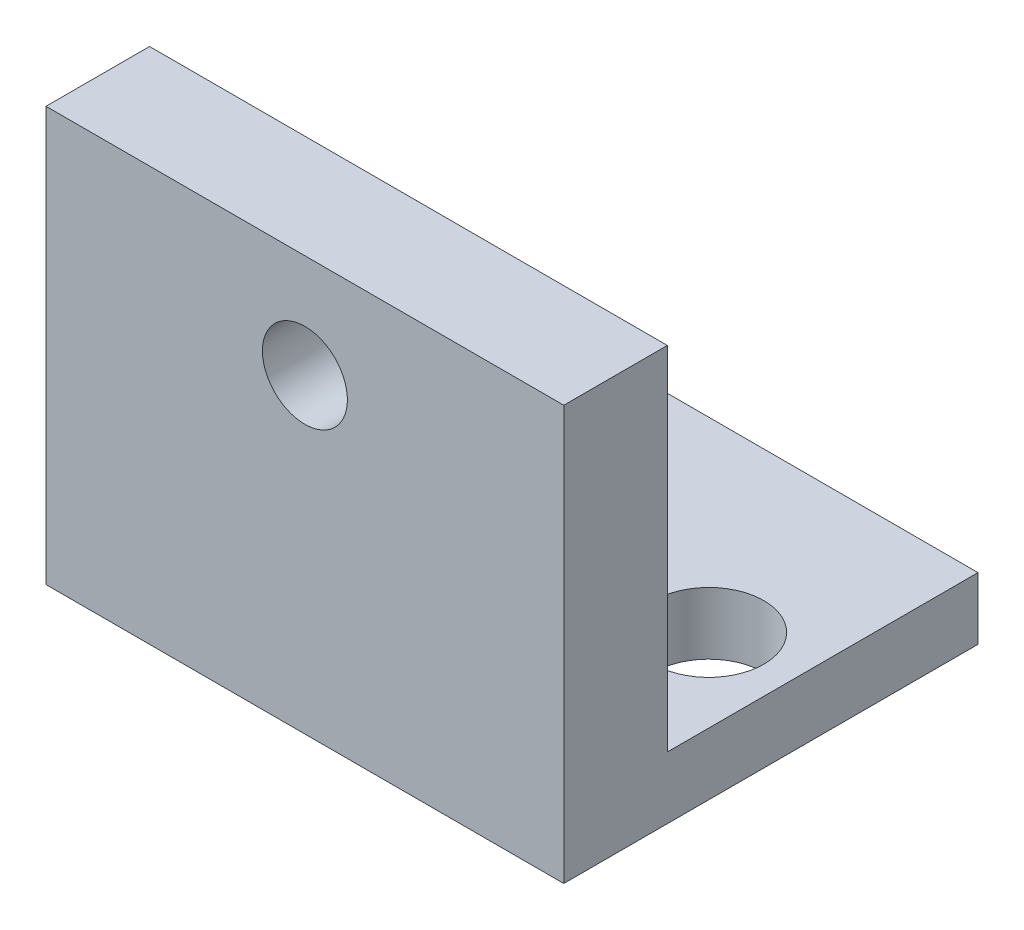
ISO-10303-21;
HEADER;
FILE_DESCRIPTION(('STEP AP214'),'2;1');
FILE_NAME('part.step','',(''),(''),'','','');
FILE_SCHEMA(('AUTOMOTIVE_DESIGN { 1 0 10303 214 1 1 1 1 }'));
ENDSEC;
DATA;
#1=APPLICATION_CONTEXT('core data for automotive mechanical design processes');
#2=APPLICATION_PROTOCOL_DEFINITION('international standard','automotive_design',2000,#1);
#3=PRODUCT_CONTEXT('',#1,'mechanical');
#4=PRODUCT('Part','Part','',(#3));
#5=PRODUCT_RELATED_PRODUCT_CATEGORY('part','',(#4));
#6=PRODUCT_DEFINITION_FORMATION('','',#4);
#7=PRODUCT_DEFINITION_CONTEXT('part definition',#1,'design');
#8=PRODUCT_DEFINITION('design','',#6,#7);
#9=PRODUCT_DEFINITION_SHAPE('','',#8);
#10=(LENGTH_UNIT() NAMED_UNIT(*) SI_UNIT(.MILLI.,.METRE.));
#11=(NAMED_UNIT(*) PLANE_ANGLE_UNIT() SI_UNIT($,.RADIAN.));
#12=(NAMED_UNIT(*) SI_UNIT($,.STERADIAN.) SOLID_ANGLE_UNIT());
#13=UNCERTAINTY_MEASURE_WITH_UNIT(LENGTH_MEASURE(1.E-05),#10,'distance_accuracy_value','');
#14=(GEOMETRIC_REPRESENTATION_CONTEXT(3) GLOBAL_UNCERTAINTY_ASSIGNED_CONTEXT((#13)) GLOBAL_UNIT_ASSIGNED_CONTEXT((#10,
#11,#12)) REPRESENTATION_CONTEXT('',''));
#15=CARTESIAN_POINT('',(0.,0.,0.));
#16=DIRECTION('',(0.,0.,1.));
#17=DIRECTION('',(1.,0.,0.));
#18=AXIS2_PLACEMENT_3D('',#15,#16,#17);
#19=CARTESIAN_POINT('',(31.75,0.,-25.4));
#20=DIRECTION('',(0.,0.,1.));
#21=DIRECTION('',(1.,0.,0.));
#22=AXIS2_PLACEMENT_3D('',#19,#20,#21);
#23=PLANE('',#22);
#24=DIRECTION('',(-1.,0.,0.));
#25=VECTOR('',#24,1.);
#26=CARTESIAN_POINT('',(0.,3.81,-25.4));
#27=LINE('',#26,#25);
#28=CARTESIAN_POINT('',(31.75,3.81,-25.4));
#29=VERTEX_POINT('',#28);
#30=CARTESIAN_POINT('',(0.,3.81,-25.4));
#31=VERTEX_POINT('',#30);
#32=EDGE_CURVE('E49',#29,#31,#27,.T.);
#33=ORIENTED_EDGE('',*,*,#32,.F.);
#34=DIRECTION('',(0.,1.,0.));
#35=VECTOR('',#34,1.);
#36=CARTESIAN_POINT('',(31.75,0.,-25.4));
#37=LINE('',#36,#35);
#38=CARTESIAN_POINT('',(31.75,0.,-25.4));
#39=VERTEX_POINT('',#38);
#40=EDGE_CURVE('E138',#39,#29,#37,.T.);
#41=ORIENTED_EDGE('',*,*,#40,.F.);
#42=DIRECTION('',(-1.,0.,0.));
#43=VECTOR('',#42,1.);
#44=CARTESIAN_POINT('',(31.75,0.,-25.4));
#45=LINE('',#44,#43);
#46=CARTESIAN_POINT('',(0.,0.,-25.4));
#47=VERTEX_POINT('',#46);
#48=EDGE_CURVE('E42',#39,#47,#45,.T.);
#49=ORIENTED_EDGE('',*,*,#48,.T.);
#50=DIRECTION('',(0.,1.,0.));
#51=VECTOR('',#50,1.);
#52=CARTESIAN_POINT('',(0.,0.,-25.4));
#53=LINE('',#52,#51);
#54=EDGE_CURVE('E104',#47,#31,#53,.T.);
#55=ORIENTED_EDGE('',*,*,#54,.T.);
#56=EDGE_LOOP('',(#33,#41,#49,#55));
#57=FACE_BOUND('',#56,.T.);
#58=ADVANCED_FACE('F33',(#57),#23,.F.);
#59=CARTESIAN_POINT('',(5.08,0.,-17.78));
#60=DIRECTION('',(0.,1.,0.));
#61=DIRECTION('',(0.,0.,1.));
#62=AXIS2_PLACEMENT_3D('',#59,#60,#61);
#63=CYLINDRICAL_SURFACE('',#62,3.3782);
#64=CARTESIAN_POINT('',(5.08,0.,-17.78));
#65=DIRECTION('',(0.,1.,0.));
#66=DIRECTION('',(0.,0.,1.));
#67=AXIS2_PLACEMENT_3D('',#64,#65,#66);
#68=CIRCLE('',#67,3.3782);
#69=CARTESIAN_POINT('',(5.08,0.,-14.4018));
#70=VERTEX_POINT('',#69);
#71=EDGE_CURVE('E125',#70,#70,#68,.T.);
#72=ORIENTED_EDGE('',*,*,#71,.F.);
#73=EDGE_LOOP('',(#72));
#74=FACE_BOUND('',#73,.T.);
#75=CARTESIAN_POINT('',(5.08,3.81,-17.78));
#76=DIRECTION('',(0.,1.,0.));
#77=DIRECTION('',(0.,0.,1.));
#78=AXIS2_PLACEMENT_3D('',#75,#76,#77);
#79=CIRCLE('',#78,3.3782);
#80=CARTESIAN_POINT('',(5.08,3.81,-14.4018));
#81=VERTEX_POINT('',#80);
#82=EDGE_CURVE('E119',#81,#81,#79,.F.);
#83=ORIENTED_EDGE('',*,*,#82,.F.);
#84=EDGE_LOOP('',(#83));
#85=FACE_BOUND('',#84,.T.);
#86=ADVANCED_FACE('F175',(#74,#85),#63,.F.);
#87=CARTESIAN_POINT('',(26.67,0.,-13.97));
#88=DIRECTION('',(0.,1.,0.));
#89=DIRECTION('',(0.,0.,1.));
#90=AXIS2_PLACEMENT_3D('',#87,#88,#89);
#91=CYLINDRICAL_SURFACE('',#90,3.3782);
#92=CARTESIAN_POINT('',(26.67,0.,-13.97));
#93=DIRECTION('',(0.,1.,0.));
#94=DIRECTION('',(0.,0.,1.));
#95=AXIS2_PLACEMENT_3D('',#92,#93,#94);
#96=CIRCLE('',#95,3.3782);
#97=CARTESIAN_POINT('',(26.67,0.,-10.5918));
#98=VERTEX_POINT('',#97);
#99=EDGE_CURVE('E122',#98,#98,#96,.T.);
#100=ORIENTED_EDGE('',*,*,#99,.F.);
#101=EDGE_LOOP('',(#100));
#102=FACE_BOUND('',#101,.T.);
#103=CARTESIAN_POINT('',(26.67,3.81,-13.97));
#104=DIRECTION('',(0.,1.,0.));
#105=DIRECTION('',(0.,0.,1.));
#106=AXIS2_PLACEMENT_3D('',#103,#104,#105);
#107=CIRCLE('',#106,3.3782);
#108=CARTESIAN_POINT('',(26.67,3.81,-10.5918));
#109=VERTEX_POINT('',#108);
#110=EDGE_CURVE('E37',#109,#109,#107,.F.);
#111=ORIENTED_EDGE('',*,*,#110,.F.);
#112=EDGE_LOOP('',(#111));
#113=FACE_BOUND('',#112,.T.);
#114=ADVANCED_FACE('F181',(#102,#113),#91,.F.);
#115=CARTESIAN_POINT('',(31.75,25.4,0.));
#116=DIRECTION('',(0.,0.,-1.));
#117=DIRECTION('',(0.,1.,0.));
#118=AXIS2_PLACEMENT_3D('',#115,#116,#117);
#119=PLANE('',#118);
#120=CARTESIAN_POINT('',(15.875,19.05,0.));
#121=DIRECTION('',(0.,0.,-1.));
#122=DIRECTION('',(-1.,0.,0.));
#123=AXIS2_PLACEMENT_3D('',#120,#121,#122);
#124=CIRCLE('',#123,2.6035);
#125=CARTESIAN_POINT('',(13.2715,19.05,0.));
#126=VERTEX_POINT('',#125);
#127=EDGE_CURVE('E129',#126,#126,#124,.T.);
#128=ORIENTED_EDGE('',*,*,#127,.T.);
#129=EDGE_LOOP('',(#128));
#130=FACE_BOUND('',#129,.T.);
#131=DIRECTION('',(0.,-1.,0.));
#132=VECTOR('',#131,1.);
#133=CARTESIAN_POINT('',(0.,25.4,0.));
#134=LINE('',#133,#132);
#135=CARTESIAN_POINT('',(0.,25.4,0.));
#136=VERTEX_POINT('',#135);
#137=CARTESIAN_POINT('',(0.,0.,0.));
#138=VERTEX_POINT('',#137);
#139=EDGE_CURVE('E132',#136,#138,#134,.T.);
#140=ORIENTED_EDGE('',*,*,#139,.T.);
#141=DIRECTION('',(-1.,0.,0.));
#142=VECTOR('',#141,1.);
#143=CARTESIAN_POINT('',(31.75,0.,0.));
#144=LINE('',#143,#142);
#145=CARTESIAN_POINT('',(31.75,0.,0.));
#146=VERTEX_POINT('',#145);
#147=EDGE_CURVE('E11',#146,#138,#144,.T.);
#148=ORIENTED_EDGE('',*,*,#147,.F.);
#149=DIRECTION('',(0.,-1.,0.));
#150=VECTOR('',#149,1.);
#151=CARTESIAN_POINT('',(31.75,25.4,0.));
#152=LINE('',#151,#150);
#153=CARTESIAN_POINT('',(31.75,25.4,0.));
#154=VERTEX_POINT('',#153);
#155=EDGE_CURVE('E135',#154,#146,#152,.T.);
#156=ORIENTED_EDGE('',*,*,#155,.F.);
#157=DIRECTION('',(-1.,0.,0.));
#158=VECTOR('',#157,1.);
#159=CARTESIAN_POINT('',(31.75,25.4,0.));
#160=LINE('',#159,#158);
#161=EDGE_CURVE('E143',#154,#136,#160,.T.);
#162=ORIENTED_EDGE('',*,*,#161,.T.);
#163=EDGE_LOOP('',(#140,#148,#156,#162));
#164=FACE_BOUND('',#163,.T.);
#165=ADVANCED_FACE('F35',(#130,#164),#119,.F.);
#166=CARTESIAN_POINT('',(31.75,0.,0.));
#167=DIRECTION('',(0.,1.,0.));
#168=DIRECTION('',(0.,0.,1.));
#169=AXIS2_PLACEMENT_3D('',#166,#167,#168);
#170=PLANE('',#169);
#171=ORIENTED_EDGE('',*,*,#99,.T.);
#172=EDGE_LOOP('',(#171));
#173=FACE_BOUND('',#172,.T.);
#174=ORIENTED_EDGE('',*,*,#71,.T.);
#175=EDGE_LOOP('',(#174));
#176=FACE_BOUND('',#175,.T.);
#177=DIRECTION('',(0.,0.,-1.));
#178=VECTOR('',#177,1.);
#179=CARTESIAN_POINT('',(0.,0.,0.));
#180=LINE('',#179,#178);
#181=EDGE_CURVE('E146',#138,#47,#180,.T.);
#182=ORIENTED_EDGE('',*,*,#181,.T.);
#183=ORIENTED_EDGE('',*,*,#48,.F.);
#184=DIRECTION('',(0.,0.,-1.));
#185=VECTOR('',#184,1.);
#186=CARTESIAN_POINT('',(31.75,0.,0.));
#187=LINE('',#186,#185);
#188=EDGE_CURVE('E86',#146,#39,#187,.T.);
#189=ORIENTED_EDGE('',*,*,#188,.F.);
#190=ORIENTED_EDGE('',*,*,#147,.T.);
#191=EDGE_LOOP('',(#182,#183,#189,#190));
#192=FACE_BOUND('',#191,.T.);
#193=ADVANCED_FACE('F157',(#173,#176,#192),#170,.F.);
#194=CARTESIAN_POINT('',(31.75,6.35,-6.35));
#195=DIRECTION('',(0.,0.,1.));
#196=DIRECTION('',(0.,-1.,0.));
#197=AXIS2_PLACEMENT_3D('',#194,#195,#196);
#198=PLANE('',#197);
#199=CARTESIAN_POINT('',(15.875,19.05,-6.35));
#200=DIRECTION('',(0.,0.,-1.));
#201=DIRECTION('',(-1.,0.,0.));
#202=AXIS2_PLACEMENT_3D('',#199,#200,#201);
#203=CIRCLE('',#202,2.6035);
#204=CARTESIAN_POINT('',(13.2715,19.05,-6.35));
#205=VERTEX_POINT('',#204);
#206=EDGE_CURVE('E128',#205,#205,#203,.T.);
#207=ORIENTED_EDGE('',*,*,#206,.F.);
#208=EDGE_LOOP('',(#207));
#209=FACE_BOUND('',#208,.T.);
#210=DIRECTION('',(0.,1.,0.));
#211=VECTOR('',#210,1.);
#212=CARTESIAN_POINT('',(0.,6.35,-6.35));
#213=LINE('',#212,#211);
#214=CARTESIAN_POINT('',(0.,3.81,-6.35));
#215=VERTEX_POINT('',#214);
#216=CARTESIAN_POINT('',(0.,25.4,-6.35));
#217=VERTEX_POINT('',#216);
#218=EDGE_CURVE('E95',#215,#217,#213,.T.);
#219=ORIENTED_EDGE('',*,*,#218,.T.);
#220=DIRECTION('',(-1.,0.,0.));
#221=VECTOR('',#220,1.);
#222=CARTESIAN_POINT('',(31.75,25.4,-6.35));
#223=LINE('',#222,#221);
#224=CARTESIAN_POINT('',(31.75,25.4,-6.35));
#225=VERTEX_POINT('',#224);
#226=EDGE_CURVE('E151',#225,#217,#223,.T.);
#227=ORIENTED_EDGE('',*,*,#226,.F.);
#228=DIRECTION('',(0.,1.,0.));
#229=VECTOR('',#228,1.);
#230=CARTESIAN_POINT('',(31.75,6.35,-6.35));
#231=LINE('',#230,#229);
#232=CARTESIAN_POINT('',(31.75,3.81,-6.35));
#233=VERTEX_POINT('',#232);
#234=EDGE_CURVE('E109',#233,#225,#231,.T.);
#235=ORIENTED_EDGE('',*,*,#234,.F.);
#236=DIRECTION('',(1.,0.,0.));
#237=VECTOR('',#236,1.);
#238=CARTESIAN_POINT('',(0.,3.81,-6.35));
#239=LINE('',#238,#237);
#240=EDGE_CURVE('E107',#215,#233,#239,.T.);
#241=ORIENTED_EDGE('',*,*,#240,.F.);
#242=EDGE_LOOP('',(#219,#227,#235,#241));
#243=FACE_BOUND('',#242,.T.);
#244=ADVANCED_FACE('F108',(#209,#243),#198,.F.);
#245=CARTESIAN_POINT('',(31.75,25.4,-6.35));
#246=DIRECTION('',(0.,-1.,0.));
#247=DIRECTION('',(0.,0.,-1.));
#248=AXIS2_PLACEMENT_3D('',#245,#246,#247);
#249=PLANE('',#248);
#250=DIRECTION('',(0.,0.,1.));
#251=VECTOR('',#250,1.);
#252=CARTESIAN_POINT('',(0.,25.4,-6.35));
#253=LINE('',#252,#251);
#254=EDGE_CURVE('E79',#217,#136,#253,.T.);
#255=ORIENTED_EDGE('',*,*,#254,.T.);
#256=ORIENTED_EDGE('',*,*,#161,.F.);
#257=DIRECTION('',(0.,0.,1.));
#258=VECTOR('',#257,1.);
#259=CARTESIAN_POINT('',(31.75,25.4,-6.35));
#260=LINE('',#259,#258);
#261=EDGE_CURVE('E58',#225,#154,#260,.T.);
#262=ORIENTED_EDGE('',*,*,#261,.F.);
#263=ORIENTED_EDGE('',*,*,#226,.T.);
#264=EDGE_LOOP('',(#255,#256,#262,#263));
#265=FACE_BOUND('',#264,.T.);
#266=ADVANCED_FACE('F160',(#265),#249,.F.);
#267=CARTESIAN_POINT('',(31.75,0.,0.));
#268=DIRECTION('',(1.,0.,0.));
#269=DIRECTION('',(0.,0.,-1.));
#270=AXIS2_PLACEMENT_3D('',#267,#268,#269);
#271=PLANE('',#270);
#272=DIRECTION('',(0.,0.,-1.));
#273=VECTOR('',#272,1.);
#274=CARTESIAN_POINT('',(31.75,3.81,-25.4));
#275=LINE('',#274,#273);
#276=EDGE_CURVE('E111',#233,#29,#275,.T.);
#277=ORIENTED_EDGE('',*,*,#276,.F.);
#278=ORIENTED_EDGE('',*,*,#234,.T.);
#279=ORIENTED_EDGE('',*,*,#261,.T.);
#280=ORIENTED_EDGE('',*,*,#155,.T.);
#281=ORIENTED_EDGE('',*,*,#188,.T.);
#282=ORIENTED_EDGE('',*,*,#40,.T.);
#283=EDGE_LOOP('',(#277,#278,#279,#280,#281,#282));
#284=FACE_BOUND('',#283,.T.);
#285=ADVANCED_FACE('F162',(#284),#271,.T.);
#286=CARTESIAN_POINT('',(0.,0.,0.));
#287=DIRECTION('',(1.,0.,0.));
#288=DIRECTION('',(0.,0.,-1.));
#289=AXIS2_PLACEMENT_3D('',#286,#287,#288);
#290=PLANE('',#289);
#291=ORIENTED_EDGE('',*,*,#218,.F.);
#292=DIRECTION('',(0.,0.,1.));
#293=VECTOR('',#292,1.);
#294=CARTESIAN_POINT('',(0.,3.81,-25.4));
#295=LINE('',#294,#293);
#296=EDGE_CURVE('E99',#31,#215,#295,.T.);
#297=ORIENTED_EDGE('',*,*,#296,.F.);
#298=ORIENTED_EDGE('',*,*,#54,.F.);
#299=ORIENTED_EDGE('',*,*,#181,.F.);
#300=ORIENTED_EDGE('',*,*,#139,.F.);
#301=ORIENTED_EDGE('',*,*,#254,.F.);
#302=EDGE_LOOP('',(#291,#297,#298,#299,#300,#301));
#303=FACE_BOUND('',#302,.T.);
#304=ADVANCED_FACE('F97',(#303),#290,.F.);
#305=CARTESIAN_POINT('',(15.875,19.05,0.));
#306=DIRECTION('',(0.,0.,-1.));
#307=DIRECTION('',(-1.,0.,0.));
#308=AXIS2_PLACEMENT_3D('',#305,#306,#307);
#309=CYLINDRICAL_SURFACE('',#308,2.6035);
#310=ORIENTED_EDGE('',*,*,#127,.F.);
#311=EDGE_LOOP('',(#310));
#312=FACE_BOUND('',#311,.T.);
#313=ORIENTED_EDGE('',*,*,#206,.T.);
#314=EDGE_LOOP('',(#313));
#315=FACE_BOUND('',#314,.T.);
#316=ADVANCED_FACE('F195',(#312,#315),#309,.F.);
#317=CARTESIAN_POINT('',(0.,3.81,0.));
#318=DIRECTION('',(0.,1.,0.));
#319=DIRECTION('',(0.,0.,1.));
#320=AXIS2_PLACEMENT_3D('',#317,#318,#319);
#321=PLANE('',#320);
#322=ORIENTED_EDGE('',*,*,#296,.T.);
#323=ORIENTED_EDGE('',*,*,#240,.T.);
#324=ORIENTED_EDGE('',*,*,#276,.T.);
#325=ORIENTED_EDGE('',*,*,#32,.T.);
#326=EDGE_LOOP('',(#322,#323,#324,#325));
#327=FACE_BOUND('',#326,.T.);
#328=ORIENTED_EDGE('',*,*,#110,.T.);
#329=EDGE_LOOP('',(#328));
#330=FACE_BOUND('',#329,.T.);
#331=ORIENTED_EDGE('',*,*,#82,.T.);
#332=EDGE_LOOP('',(#331));
#333=FACE_BOUND('',#332,.T.);
#334=ADVANCED_FACE('F113',(#327,#330,#333),#321,.T.);
#335=CLOSED_SHELL('',(#58,#86,#114,#165,#193,#244,#266,#285,#304,#316,#334));
#336=MANIFOLD_SOLID_BREP('B2',#335);
#337=ADVANCED_BREP_SHAPE_REPRESENTATION('',(#18,#336),#14);
#338=SHAPE_DEFINITION_REPRESENTATION(#9,#337);
ENDSEC;
END-ISO-10303-21;
